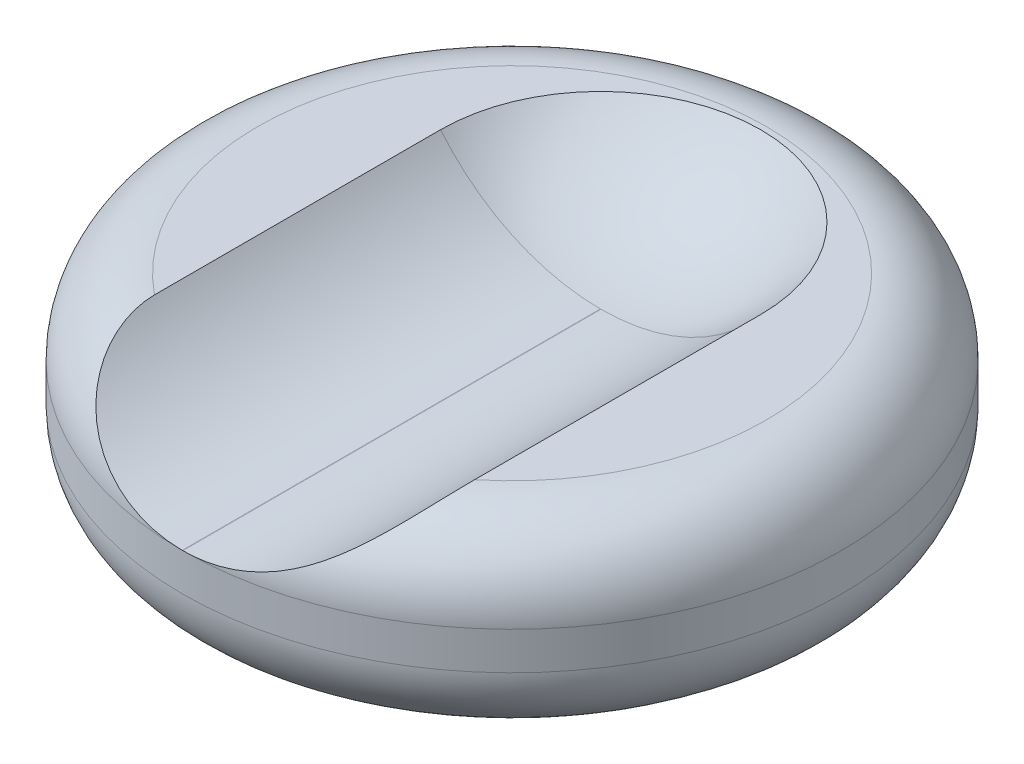
ISO-10303-21;
HEADER;
FILE_DESCRIPTION(('STEP AP214'),'2;1');
FILE_NAME('part.step','',(''),(''),'','','');
FILE_SCHEMA(('AUTOMOTIVE_DESIGN { 1 0 10303 214 1 1 1 1 }'));
ENDSEC;
DATA;
#1=APPLICATION_CONTEXT('core data for automotive mechanical design processes');
#2=APPLICATION_PROTOCOL_DEFINITION('international standard','automotive_design',2000,#1);
#3=PRODUCT_CONTEXT('',#1,'mechanical');
#4=PRODUCT('Part','Part','',(#3));
#5=PRODUCT_RELATED_PRODUCT_CATEGORY('part','',(#4));
#6=PRODUCT_DEFINITION_FORMATION('','',#4);
#7=PRODUCT_DEFINITION_CONTEXT('part definition',#1,'design');
#8=PRODUCT_DEFINITION('design','',#6,#7);
#9=PRODUCT_DEFINITION_SHAPE('','',#8);
#10=(LENGTH_UNIT() NAMED_UNIT(*) SI_UNIT(.MILLI.,.METRE.));
#11=(NAMED_UNIT(*) PLANE_ANGLE_UNIT() SI_UNIT($,.RADIAN.));
#12=(NAMED_UNIT(*) SI_UNIT($,.STERADIAN.) SOLID_ANGLE_UNIT());
#13=UNCERTAINTY_MEASURE_WITH_UNIT(LENGTH_MEASURE(1.E-05),#10,'distance_accuracy_value','');
#14=(GEOMETRIC_REPRESENTATION_CONTEXT(3) GLOBAL_UNCERTAINTY_ASSIGNED_CONTEXT((#13)) GLOBAL_UNIT_ASSIGNED_CONTEXT((#10,
#11,#12)) REPRESENTATION_CONTEXT('',''));
#15=CARTESIAN_POINT('',(0.,0.,0.));
#16=DIRECTION('',(0.,0.,1.));
#17=DIRECTION('',(1.,0.,0.));
#18=AXIS2_PLACEMENT_3D('',#15,#16,#17);
#19=CARTESIAN_POINT('',(0.,10.,0.));
#20=DIRECTION('',(0.,-1.,0.));
#21=DIRECTION('',(0.,0.,-1.));
#22=AXIS2_PLACEMENT_3D('',#19,#20,#21);
#23=CYLINDRICAL_SURFACE('',#22,17.5);
#24=CARTESIAN_POINT('',(0.,4.,0.));
#25=DIRECTION('',(0.,1.,0.));
#26=DIRECTION('',(0.,0.,1.));
#27=AXIS2_PLACEMENT_3D('',#24,#25,#26);
#28=CIRCLE('',#27,17.5);
#29=CARTESIAN_POINT('',(0.,4.,17.5));
#30=VERTEX_POINT('',#29);
#31=EDGE_CURVE('E172',#30,#30,#28,.T.);
#32=ORIENTED_EDGE('',*,*,#31,.T.);
#33=EDGE_LOOP('',(#32));
#34=FACE_BOUND('',#33,.T.);
#35=CARTESIAN_POINT('',(0.,6.,0.));
#36=DIRECTION('',(0.,1.,0.));
#37=DIRECTION('',(0.,0.,1.));
#38=AXIS2_PLACEMENT_3D('',#35,#36,#37);
#39=CIRCLE('',#38,17.5);
#40=CARTESIAN_POINT('',(-0.0147186257614344,6.,17.4999938103434));
#41=VERTEX_POINT('',#40);
#42=CARTESIAN_POINT('',(0.0147186257614347,6.,17.4999938103434));
#43=VERTEX_POINT('',#42);
#44=EDGE_CURVE('E58',#41,#43,#39,.F.);
#45=ORIENTED_EDGE('',*,*,#44,.T.);
#46=EDGE_CURVE('E151',#43,#41,#39,.F.);
#47=ORIENTED_EDGE('',*,*,#46,.T.);
#48=EDGE_LOOP('',(#45,#47));
#49=FACE_BOUND('',#48,.T.);
#50=ADVANCED_FACE('F39',(#34,#49),#23,.T.);
#51=CARTESIAN_POINT('',(0.,10.,0.));
#52=DIRECTION('',(0.,1.,0.));
#53=DIRECTION('',(0.,0.,1.));
#54=AXIS2_PLACEMENT_3D('',#51,#52,#53);
#55=PLANE('',#54);
#56=DIRECTION('',(0.,0.,1.));
#57=VECTOR('',#56,1.);
#58=CARTESIAN_POINT('',(-8.5,10.,15.2970585407784));
#59=LINE('',#58,#57);
#60=CARTESIAN_POINT('',(-8.5,10.,-4.70294145922164));
#61=VERTEX_POINT('',#60);
#62=CARTESIAN_POINT('',(-8.5,10.,10.4880884817015));
#63=VERTEX_POINT('',#62);
#64=EDGE_CURVE('E85',#61,#63,#59,.T.);
#65=ORIENTED_EDGE('',*,*,#64,.F.);
#66=CARTESIAN_POINT('',(0.,10.,-4.70294145922164));
#67=DIRECTION('',(0.,1.,0.));
#68=DIRECTION('',(0.,0.,-1.));
#69=AXIS2_PLACEMENT_3D('',#66,#67,#68);
#70=CIRCLE('',#69,8.5);
#71=CARTESIAN_POINT('',(8.5,10.,-4.70294145922164));
#72=VERTEX_POINT('',#71);
#73=EDGE_CURVE('E78',#72,#61,#70,.T.);
#74=ORIENTED_EDGE('',*,*,#73,.F.);
#75=DIRECTION('',(0.,0.,-1.));
#76=VECTOR('',#75,1.);
#77=CARTESIAN_POINT('',(8.5,10.,15.2970585407784));
#78=LINE('',#77,#76);
#79=CARTESIAN_POINT('',(8.5,10.,10.4880884817015));
#80=VERTEX_POINT('',#79);
#81=EDGE_CURVE('E82',#80,#72,#78,.T.);
#82=ORIENTED_EDGE('',*,*,#81,.F.);
#83=CARTESIAN_POINT('',(0.,10.,0.));
#84=DIRECTION('',(0.,1.,0.));
#85=DIRECTION('',(0.,0.,1.));
#86=AXIS2_PLACEMENT_3D('',#83,#84,#85);
#87=CIRCLE('',#86,13.5);
#88=EDGE_CURVE('E158',#80,#63,#87,.T.);
#89=ORIENTED_EDGE('',*,*,#88,.T.);
#90=EDGE_LOOP('',(#65,#74,#82,#89));
#91=FACE_BOUND('',#90,.T.);
#92=ADVANCED_FACE('F80',(#91),#55,.T.);
#93=CARTESIAN_POINT('',(0.,0.,0.));
#94=DIRECTION('',(0.,1.,0.));
#95=DIRECTION('',(0.,0.,1.));
#96=AXIS2_PLACEMENT_3D('',#93,#94,#95);
#97=PLANE('',#96);
#98=CARTESIAN_POINT('',(0.,0.,0.));
#99=DIRECTION('',(0.,1.,0.));
#100=DIRECTION('',(0.,0.,1.));
#101=AXIS2_PLACEMENT_3D('',#98,#99,#100);
#102=CIRCLE('',#101,13.5);
#103=CARTESIAN_POINT('',(0.,0.,13.5));
#104=VERTEX_POINT('',#103);
#105=EDGE_CURVE('E168',#104,#104,#102,.F.);
#106=ORIENTED_EDGE('',*,*,#105,.T.);
#107=EDGE_LOOP('',(#106));
#108=FACE_BOUND('',#107,.T.);
#109=ADVANCED_FACE('F139',(#108),#97,.F.);
#110=CARTESIAN_POINT('',(0.,4.,0.));
#111=DIRECTION('',(0.,1.,0.));
#112=DIRECTION('',(0.,0.,1.));
#113=AXIS2_PLACEMENT_3D('',#110,#111,#112);
#114=TOROIDAL_SURFACE('',#113,13.5,4.);
#115=ORIENTED_EDGE('',*,*,#105,.F.);
#116=EDGE_LOOP('',(#115));
#117=FACE_BOUND('',#116,.T.);
#118=ORIENTED_EDGE('',*,*,#31,.F.);
#119=EDGE_LOOP('',(#118));
#120=FACE_BOUND('',#119,.T.);
#121=ADVANCED_FACE('F123',(#117,#120),#114,.T.);
#122=CARTESIAN_POINT('',(0.,6.,0.));
#123=DIRECTION('',(0.,1.,0.));
#124=DIRECTION('',(0.,0.,1.));
#125=AXIS2_PLACEMENT_3D('',#122,#123,#124);
#126=TOROIDAL_SURFACE('',#125,13.5,4.);
#127=ORIENTED_EDGE('',*,*,#44,.F.);
#128=CARTESIAN_POINT('',(-0.0147186257614344,6.,17.4999938103434));
#129=CARTESIAN_POINT('',(-0.143842716192351,5.99999926132225,17.4998803673791));
#130=CARTESIAN_POINT('',(-0.272950418249564,6.00227408904659,17.4983478719293));
#131=CARTESIAN_POINT('',(-0.530942690645946,6.01136154289432,17.4924072275457));
#132=CARTESIAN_POINT('',(-0.659827255665567,6.01817427574687,17.4879990109766));
#133=CARTESIAN_POINT('',(-1.04590074828276,6.04540263595358,17.4704023200698));
#134=CARTESIAN_POINT('',(-1.30245998677221,6.07260841533782,17.4528418189987));
#135=CARTESIAN_POINT('',(-1.81333222980912,6.1449579434122,17.4052235355738));
#136=CARTESIAN_POINT('',(-2.06762439327012,6.19020203553148,17.3750958001584));
#137=CARTESIAN_POINT('',(-2.57050082641366,6.29794088008187,17.3011865001043));
#138=CARTESIAN_POINT('',(-2.81908583340788,6.36043339043831,17.2574067099629));
#139=CARTESIAN_POINT('',(-3.30583864740517,6.5008570262973,17.1552732966709));
#140=CARTESIAN_POINT('',(-3.54408899709586,6.57861731340174,17.0970792300663));
#141=CARTESIAN_POINT('',(-4.01074625864378,6.74849259166541,16.9643014963375));
#142=CARTESIAN_POINT('',(-4.23915285432117,6.84060804347226,16.8897173032336));
#143=CARTESIAN_POINT('',(-4.68312361995507,7.03683220026557,16.7228338778281));
#144=CARTESIAN_POINT('',(-4.89872523758903,7.14090302653568,16.630590010376));
#145=CARTESIAN_POINT('',(-5.31553395581246,7.35859949205166,16.4268555215756));
#146=CARTESIAN_POINT('',(-5.51674367728285,7.47222338336604,16.3153684172631));
#147=CARTESIAN_POINT('',(-5.87985399897665,7.69195010517204,16.0864921952867));
#148=CARTESIAN_POINT('',(-6.04359211926836,7.79735994766997,15.9713491465433));
#149=CARTESIAN_POINT('',(-6.35689933733306,8.01041594812754,15.7249529246014));
#150=CARTESIAN_POINT('',(-6.50646935400166,8.11806196050381,15.5937007974529));
#151=CARTESIAN_POINT('',(-6.79039123851418,8.33270791688596,15.3151134250441));
#152=CARTESIAN_POINT('',(-6.92474077818235,8.43970775968819,15.1677757260306));
#153=CARTESIAN_POINT('',(-7.17741582293226,8.6499826594098,14.8575244405708));
#154=CARTESIAN_POINT('',(-7.29574322177698,8.7532581554739,14.6946126988141));
#155=CARTESIAN_POINT('',(-7.50178742875666,8.94018563910231,14.3760192770571));
#156=CARTESIAN_POINT('',(-7.59148380673469,9.02465516608932,14.2220924070199));
#157=CARTESIAN_POINT('',(-7.75824426497957,9.18646617824258,13.9039974695641));
#158=CARTESIAN_POINT('',(-7.83530975404389,9.26380845793092,13.7398305471026));
#159=CARTESIAN_POINT('',(-7.97673439961159,9.40943978687,13.4025227323137));
#160=CARTESIAN_POINT('',(-8.04110813969219,9.477739196913,13.229392431816));
#161=CARTESIAN_POINT('',(-8.15733290277052,9.60370469277169,12.875218384264));
#162=CARTESIAN_POINT('',(-8.20918385585131,9.66137071921889,12.694174593034));
#163=CARTESIAN_POINT('',(-8.29467743980676,9.7580453725618,12.3487477596008));
#164=CARTESIAN_POINT('',(-8.32978889021434,9.79848752300739,12.1851271676631));
#165=CARTESIAN_POINT('',(-8.39041628492326,9.86909236917222,11.8539904497702));
#166=CARTESIAN_POINT('',(-8.41593586811327,9.89925896274508,11.6864758267645));
#167=CARTESIAN_POINT('',(-8.45730057401085,9.94848223504735,11.3480380925155));
#168=CARTESIAN_POINT('',(-8.4731135466061,9.96750198403037,11.1771055700212));
#169=CARTESIAN_POINT('',(-8.49443323814248,9.99325141795279,10.8335162485303));
#170=CARTESIAN_POINT('',(-8.49992928680598,9.99996837856047,10.6608578498224));
#171=CARTESIAN_POINT('',(-8.5,10.,10.4880884817015));
#172=B_SPLINE_CURVE_WITH_KNOTS('',3,(#128,#129,#130,#131,#132,#133,#134,#135,#136,#137,#138,
#139,#140,#141,#142,#143,#144,#145,#146,#147,#148,#149,#150,#151,#152,#153,#154,#155,#156,#157,
#158,#159,#160,#161,#162,#163,#164,#165,#166,#167,#168,#169,#170,#171),.UNSPECIFIED.,.F.,.F.,(4,
2,2,2,2,2,2,2,2,2,2,2,2,2,2,2,2,2,2,2,2,4),(0.,0.387313936407786,0.774636982557817,
1.5494310690854,2.32859669436724,3.107661085703,3.87845961415009,4.6492828821009,
5.41772798558018,6.18603279079809,6.86374240507477,7.54140803524444,8.21917718388601,
8.89686615244155,9.48759283595996,10.0782535873469,10.6682316272099,11.2582129609479,
11.7741129249626,12.289816972803,12.8072200400927,13.3251579372496),.UNSPECIFIED.);
#173=EDGE_CURVE('E11',#41,#63,#172,.T.);
#174=ORIENTED_EDGE('',*,*,#173,.T.);
#175=ORIENTED_EDGE('',*,*,#88,.F.);
#176=CARTESIAN_POINT('',(8.5,10.,10.4880884817015));
#177=CARTESIAN_POINT('',(8.49993220676998,9.99996974363789,10.6589539028226));
#178=CARTESIAN_POINT('',(8.49455508526296,9.99339918788297,10.8297135580053));
#179=CARTESIAN_POINT('',(8.47369147568368,9.96819852197954,11.1695860838789));
#180=CARTESIAN_POINT('',(8.45821364921937,9.94957874445562,11.3387002396376));
#181=CARTESIAN_POINT('',(8.41773618494707,9.90139251694841,11.6734810817294));
#182=CARTESIAN_POINT('',(8.39277440001699,9.87186959710134,11.8391587470136));
#183=CARTESIAN_POINT('',(8.33348126701224,9.80275938445879,12.1667248684136));
#184=CARTESIAN_POINT('',(8.29914799991048,9.76317003044256,12.3286125410609));
#185=CARTESIAN_POINT('',(8.22309208726239,9.67704068916275,12.639690548688));
#186=CARTESIAN_POINT('',(8.18181797606622,9.63094038684392,12.7891131554503));
#187=CARTESIAN_POINT('',(8.09082573057107,9.53132919171787,13.0828298453834));
#188=CARTESIAN_POINT('',(8.0411074257374,9.47781814925111,13.227123824908));
#189=CARTESIAN_POINT('',(7.93314144322511,9.36424721297966,13.5099822446912));
#190=CARTESIAN_POINT('',(7.87488644796911,9.30418171214324,13.648541637312));
#191=CARTESIAN_POINT('',(7.74987752594531,9.17854454453125,13.9191069765195));
#192=CARTESIAN_POINT('',(7.68312630652821,9.11297463401074,14.051114992181));
#193=CARTESIAN_POINT('',(7.53284900473236,8.96945044750648,14.3230436964743));
#194=CARTESIAN_POINT('',(7.44827463618213,8.89094327420286,14.4620949603052));
#195=CARTESIAN_POINT('',(7.26864829606471,8.72986979906708,14.7307581239056));
#196=CARTESIAN_POINT('',(7.17359573355982,8.64730326844536,14.8603694906088));
#197=CARTESIAN_POINT('',(6.97325030738474,8.47967776421939,15.1096891838054));
#198=CARTESIAN_POINT('',(6.86795714675382,8.39461871838626,15.2293972229319));
#199=CARTESIAN_POINT('',(6.64749618884959,8.22356980569114,15.4586266174468));
#200=CARTESIAN_POINT('',(6.53232771375476,8.13757987528964,15.5681472725165));
#201=CARTESIAN_POINT('',(6.2859851044571,7.96145012000274,15.7826608068369));
#202=CARTESIAN_POINT('',(6.154278216389,7.87134350335792,15.8870692069779));
#203=CARTESIAN_POINT('',(5.88113119624517,7.69345559002056,16.0845033216754));
#204=CARTESIAN_POINT('',(5.73969070755585,7.60567437868812,16.1775286188375));
#205=CARTESIAN_POINT('',(5.44787842251476,7.43394342629818,16.3524830736771));
#206=CARTESIAN_POINT('',(5.29750533777948,7.34999424105196,16.4344106250655));
#207=CARTESIAN_POINT('',(4.98873208149441,7.18727084525549,16.5875911031752));
#208=CARTESIAN_POINT('',(4.83033116317406,7.10849711771108,16.6588430343737));
#209=CARTESIAN_POINT('',(4.4919138319959,6.95049038315032,16.7971515694728));
#210=CARTESIAN_POINT('',(4.31123282979352,6.8718496221102,16.8632590214132));
#211=CARTESIAN_POINT('',(3.94267151768528,6.72329455901283,16.9842496801296));
#212=CARTESIAN_POINT('',(3.75479066029703,6.65338092230046,17.0391320313217));
#213=CARTESIAN_POINT('',(3.37285183492852,6.52318318538249,17.1385631197817));
#214=CARTESIAN_POINT('',(3.1787881177727,6.46290838103992,17.183101900019));
#215=CARTESIAN_POINT('',(2.78579937965343,6.35280518871013,17.2626054276414));
#216=CARTESIAN_POINT('',(2.5868741948017,6.30297715344507,17.2975698517726));
#217=CARTESIAN_POINT('',(2.192760362273,6.21596877442239,17.3575307143328));
#218=CARTESIAN_POINT('',(1.99770926493425,6.17838586792649,17.382850419361));
#219=CARTESIAN_POINT('',(1.60503948802501,6.11374816339298,17.4258659149394));
#220=CARTESIAN_POINT('',(1.40742077134686,6.08669351768682,17.4435615951795));
#221=CARTESIAN_POINT('',(1.01102266231496,6.04340365101577,17.4717227279722));
#222=CARTESIAN_POINT('',(0.812247679338928,6.02714021117314,17.48220704082));
#223=CARTESIAN_POINT('',(0.41388733161492,6.00543129910396,17.4962427753046));
#224=CARTESIAN_POINT('',(0.214302068223042,5.99998451323381,17.4997950388129));
#225=CARTESIAN_POINT('',(0.014718625761434,6.,17.4999938103434));
#226=B_SPLINE_CURVE_WITH_KNOTS('',3,(#176,#177,#178,#179,#180,#181,#182,#183,#184,#185,#186,
#187,#188,#189,#190,#191,#192,#193,#194,#195,#196,#197,#198,#199,#200,#201,#202,#203,#204,#205,
#206,#207,#208,#209,#210,#211,#212,#213,#214,#215,#216,#217,#218,#219,#220,#221,#222,#223,#224,
#225),.UNSPECIFIED.,.F.,.F.,(4,2,2,2,2,2,2,2,2,2,2,2,2,2,2,2,2,2,2,2,2,2,2,2,4),(0.,
0.512240757575409,1.02404283202876,1.53382327606609,2.04370818782115,2.52841833429723,
3.01313827089953,3.49827616243169,3.98325984834517,4.52473575605614,5.0662422169704,
5.60776438537796,6.14932375256572,6.72080430250432,7.2923058011502,7.86388993080119,
8.43552732868049,9.05842483025878,9.68136979178452,10.3049119558657,10.9284751696837,
11.5287704611835,12.1290744379215,12.7278023743345,13.3264575929517),.UNSPECIFIED.);
#227=EDGE_CURVE('E51',#80,#43,#226,.T.);
#228=ORIENTED_EDGE('',*,*,#227,.T.);
#229=EDGE_LOOP('',(#127,#174,#175,#228));
#230=FACE_BOUND('',#229,.T.);
#231=ADVANCED_FACE('F118',(#230),#126,.T.);
#232=CARTESIAN_POINT('',(0.,6.,15.2970585407784));
#233=DIRECTION('',(0.,1.,0.));
#234=DIRECTION('',(0.,0.,1.));
#235=AXIS2_PLACEMENT_3D('',#232,#233,#234);
#236=PLANE('',#235);
#237=ORIENTED_EDGE('',*,*,#46,.F.);
#238=DIRECTION('',(0.,0.,-1.));
#239=VECTOR('',#238,1.);
#240=CARTESIAN_POINT('',(0.0147186257614309,6.,-4.70294145922164));
#241=LINE('',#240,#239);
#242=CARTESIAN_POINT('',(0.0147186257614296,6.,-4.70294145922164));
#243=VERTEX_POINT('',#242);
#244=EDGE_CURVE('E152',#43,#243,#241,.T.);
#245=ORIENTED_EDGE('',*,*,#244,.T.);
#246=CARTESIAN_POINT('',(0.,6.,-4.70294145922164));
#247=DIRECTION('',(0.,1.,0.));
#248=DIRECTION('',(0.,0.,1.));
#249=AXIS2_PLACEMENT_3D('',#246,#247,#248);
#250=CIRCLE('',#249,0.0147186257614326);
#251=CARTESIAN_POINT('',(-0.0147186257614344,6.,-4.70294145922164));
#252=VERTEX_POINT('',#251);
#253=EDGE_CURVE('E102',#243,#252,#250,.T.);
#254=ORIENTED_EDGE('',*,*,#253,.T.);
#255=DIRECTION('',(0.,0.,1.));
#256=VECTOR('',#255,1.);
#257=CARTESIAN_POINT('',(-0.0147186257614344,6.,15.2970585407784));
#258=LINE('',#257,#256);
#259=EDGE_CURVE('E154',#252,#41,#258,.T.);
#260=ORIENTED_EDGE('',*,*,#259,.T.);
#261=EDGE_LOOP('',(#237,#245,#254,#260));
#262=FACE_BOUND('',#261,.T.);
#263=ADVANCED_FACE('F122',(#262),#236,.T.);
#264=CARTESIAN_POINT('',(-0.0147186257614344,17.,15.2970585407784));
#265=DIRECTION('',(0.,0.,-1.));
#266=DIRECTION('',(-1.,0.,0.));
#267=AXIS2_PLACEMENT_3D('',#264,#265,#266);
#268=CYLINDRICAL_SURFACE('',#267,11.);
#269=ORIENTED_EDGE('',*,*,#173,.F.);
#270=ORIENTED_EDGE('',*,*,#259,.F.);
#271=CARTESIAN_POINT('',(-0.014718625761433,17.,-4.70294145922164));
#272=DIRECTION('',(0.,0.,1.));
#273=DIRECTION('',(1.,0.,0.));
#274=AXIS2_PLACEMENT_3D('',#271,#272,#273);
#275=CIRCLE('',#274,11.);
#276=EDGE_CURVE('E44',#61,#252,#275,.T.);
#277=ORIENTED_EDGE('',*,*,#276,.F.);
#278=ORIENTED_EDGE('',*,*,#64,.T.);
#279=EDGE_LOOP('',(#269,#270,#277,#278));
#280=FACE_BOUND('',#279,.T.);
#281=ADVANCED_FACE('F41',(#280),#268,.F.);
#282=CARTESIAN_POINT('',(0.,17.,-4.70294145922164));
#283=DIRECTION('',(0.,-1.,0.));
#284=DIRECTION('',(0.,0.,-1.));
#285=AXIS2_PLACEMENT_3D('',#282,#283,#284);
#286=DEGENERATE_TOROIDAL_SURFACE('',#285,0.0147186257614326,11.,.T.);
#287=ORIENTED_EDGE('',*,*,#276,.T.);
#288=ORIENTED_EDGE('',*,*,#253,.F.);
#289=CARTESIAN_POINT('',(0.0147186257614296,17.,-4.70294145922164));
#290=DIRECTION('',(0.,0.,-1.));
#291=DIRECTION('',(-1.,0.,0.));
#292=AXIS2_PLACEMENT_3D('',#289,#290,#291);
#293=CIRCLE('',#292,11.);
#294=EDGE_CURVE('E96',#72,#243,#293,.T.);
#295=ORIENTED_EDGE('',*,*,#294,.F.);
#296=ORIENTED_EDGE('',*,*,#73,.T.);
#297=EDGE_LOOP('',(#287,#288,#295,#296));
#298=FACE_BOUND('',#297,.T.);
#299=ADVANCED_FACE('F101',(#298),#286,.F.);
#300=CARTESIAN_POINT('',(0.0147186257614344,17.,15.2970585407784));
#301=DIRECTION('',(0.,0.,1.));
#302=DIRECTION('',(1.,0.,0.));
#303=AXIS2_PLACEMENT_3D('',#300,#301,#302);
#304=CYLINDRICAL_SURFACE('',#303,11.);
#305=ORIENTED_EDGE('',*,*,#227,.F.);
#306=ORIENTED_EDGE('',*,*,#81,.T.);
#307=ORIENTED_EDGE('',*,*,#294,.T.);
#308=ORIENTED_EDGE('',*,*,#244,.F.);
#309=EDGE_LOOP('',(#305,#306,#307,#308));
#310=FACE_BOUND('',#309,.T.);
#311=ADVANCED_FACE('F94',(#310),#304,.F.);
#312=CLOSED_SHELL('',(#50,#92,#109,#121,#231,#263,#281,#299,#311));
#313=MANIFOLD_SOLID_BREP('B2',#312);
#314=ADVANCED_BREP_SHAPE_REPRESENTATION('',(#18,#313),#14);
#315=SHAPE_DEFINITION_REPRESENTATION(#9,#314);
ENDSEC;
END-ISO-10303-21;
